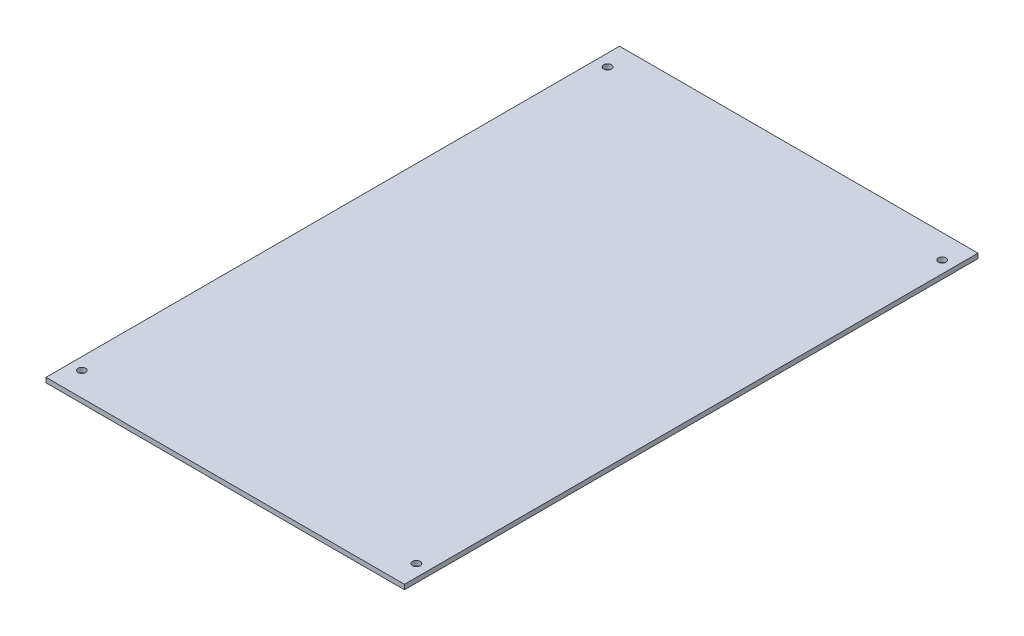
ISO-10303-21;
HEADER;
FILE_DESCRIPTION(('STEP AP214'),'2;1');
FILE_NAME('part.step','',(''),(''),'','','');
FILE_SCHEMA(('AUTOMOTIVE_DESIGN { 1 0 10303 214 1 1 1 1 }'));
ENDSEC;
DATA;
#1=APPLICATION_CONTEXT('core data for automotive mechanical design processes');
#2=APPLICATION_PROTOCOL_DEFINITION('international standard','automotive_design',2000,#1);
#3=PRODUCT_CONTEXT('',#1,'mechanical');
#4=PRODUCT('Part','Part','',(#3));
#5=PRODUCT_RELATED_PRODUCT_CATEGORY('part','',(#4));
#6=PRODUCT_DEFINITION_FORMATION('','',#4);
#7=PRODUCT_DEFINITION_CONTEXT('part definition',#1,'design');
#8=PRODUCT_DEFINITION('design','',#6,#7);
#9=PRODUCT_DEFINITION_SHAPE('','',#8);
#10=(LENGTH_UNIT() NAMED_UNIT(*) SI_UNIT(.MILLI.,.METRE.));
#11=(NAMED_UNIT(*) PLANE_ANGLE_UNIT() SI_UNIT($,.RADIAN.));
#12=(NAMED_UNIT(*) SI_UNIT($,.STERADIAN.) SOLID_ANGLE_UNIT());
#13=UNCERTAINTY_MEASURE_WITH_UNIT(LENGTH_MEASURE(1.E-05),#10,'distance_accuracy_value','');
#14=(GEOMETRIC_REPRESENTATION_CONTEXT(3) GLOBAL_UNCERTAINTY_ASSIGNED_CONTEXT((#13)) GLOBAL_UNIT_ASSIGNED_CONTEXT((#10,
#11,#12)) REPRESENTATION_CONTEXT('',''));
#15=CARTESIAN_POINT('',(0.,0.,0.));
#16=DIRECTION('',(0.,0.,1.));
#17=DIRECTION('',(1.,0.,0.));
#18=AXIS2_PLACEMENT_3D('',#15,#16,#17);
#19=CARTESIAN_POINT('',(0.,2.,0.));
#20=DIRECTION('',(1.,0.,0.));
#21=DIRECTION('',(0.,0.,-1.));
#22=AXIS2_PLACEMENT_3D('',#19,#20,#21);
#23=PLANE('',#22);
#24=DIRECTION('',(0.,0.,1.));
#25=VECTOR('',#24,1.);
#26=CARTESIAN_POINT('',(0.,0.,0.));
#27=LINE('',#26,#25);
#28=CARTESIAN_POINT('',(0.,0.,-240.));
#29=VERTEX_POINT('',#28);
#30=CARTESIAN_POINT('',(0.,0.,0.));
#31=VERTEX_POINT('',#30);
#32=EDGE_CURVE('E96',#29,#31,#27,.T.);
#33=ORIENTED_EDGE('',*,*,#32,.T.);
#34=DIRECTION('',(0.,-1.,0.));
#35=VECTOR('',#34,1.);
#36=CARTESIAN_POINT('',(0.,2.,0.));
#37=LINE('',#36,#35);
#38=CARTESIAN_POINT('',(0.,2.,0.));
#39=VERTEX_POINT('',#38);
#40=EDGE_CURVE('E11',#39,#31,#37,.T.);
#41=ORIENTED_EDGE('',*,*,#40,.F.);
#42=DIRECTION('',(0.,0.,1.));
#43=VECTOR('',#42,1.);
#44=CARTESIAN_POINT('',(0.,2.,0.));
#45=LINE('',#44,#43);
#46=CARTESIAN_POINT('',(0.,2.,-240.));
#47=VERTEX_POINT('',#46);
#48=EDGE_CURVE('E84',#47,#39,#45,.T.);
#49=ORIENTED_EDGE('',*,*,#48,.F.);
#50=DIRECTION('',(0.,-1.,0.));
#51=VECTOR('',#50,1.);
#52=CARTESIAN_POINT('',(0.,2.,-240.));
#53=LINE('',#52,#51);
#54=EDGE_CURVE('E92',#47,#29,#53,.T.);
#55=ORIENTED_EDGE('',*,*,#54,.T.);
#56=EDGE_LOOP('',(#33,#41,#49,#55));
#57=FACE_BOUND('',#56,.T.);
#58=ADVANCED_FACE('F33',(#57),#23,.F.);
#59=CARTESIAN_POINT('',(0.,2.,0.));
#60=DIRECTION('',(0.,0.,-1.));
#61=DIRECTION('',(-1.,0.,0.));
#62=AXIS2_PLACEMENT_3D('',#59,#60,#61);
#63=PLANE('',#62);
#64=DIRECTION('',(1.,0.,0.));
#65=VECTOR('',#64,1.);
#66=CARTESIAN_POINT('',(0.,0.,0.));
#67=LINE('',#66,#65);
#68=CARTESIAN_POINT('',(150.,0.,0.));
#69=VERTEX_POINT('',#68);
#70=EDGE_CURVE('E88',#31,#69,#67,.T.);
#71=ORIENTED_EDGE('',*,*,#70,.T.);
#72=DIRECTION('',(0.,-1.,0.));
#73=VECTOR('',#72,1.);
#74=CARTESIAN_POINT('',(150.,2.,0.));
#75=LINE('',#74,#73);
#76=CARTESIAN_POINT('',(150.,2.,0.));
#77=VERTEX_POINT('',#76);
#78=EDGE_CURVE('E41',#77,#69,#75,.T.);
#79=ORIENTED_EDGE('',*,*,#78,.F.);
#80=DIRECTION('',(1.,0.,0.));
#81=VECTOR('',#80,1.);
#82=CARTESIAN_POINT('',(0.,2.,0.));
#83=LINE('',#82,#81);
#84=EDGE_CURVE('E79',#39,#77,#83,.T.);
#85=ORIENTED_EDGE('',*,*,#84,.F.);
#86=ORIENTED_EDGE('',*,*,#40,.T.);
#87=EDGE_LOOP('',(#71,#79,#85,#86));
#88=FACE_BOUND('',#87,.T.);
#89=ADVANCED_FACE('F87',(#88),#63,.F.);
#90=CARTESIAN_POINT('',(150.,2.,0.));
#91=DIRECTION('',(-1.,0.,0.));
#92=DIRECTION('',(0.,0.,1.));
#93=AXIS2_PLACEMENT_3D('',#90,#91,#92);
#94=PLANE('',#93);
#95=DIRECTION('',(0.,0.,-1.));
#96=VECTOR('',#95,1.);
#97=CARTESIAN_POINT('',(150.,0.,0.));
#98=LINE('',#97,#96);
#99=CARTESIAN_POINT('',(150.,0.,-240.));
#100=VERTEX_POINT('',#99);
#101=EDGE_CURVE('E66',#69,#100,#98,.T.);
#102=ORIENTED_EDGE('',*,*,#101,.T.);
#103=DIRECTION('',(0.,-1.,0.));
#104=VECTOR('',#103,1.);
#105=CARTESIAN_POINT('',(150.,2.,-240.));
#106=LINE('',#105,#104);
#107=CARTESIAN_POINT('',(150.,2.,-240.));
#108=VERTEX_POINT('',#107);
#109=EDGE_CURVE('E89',#108,#100,#106,.T.);
#110=ORIENTED_EDGE('',*,*,#109,.F.);
#111=DIRECTION('',(0.,0.,-1.));
#112=VECTOR('',#111,1.);
#113=CARTESIAN_POINT('',(150.,2.,0.));
#114=LINE('',#113,#112);
#115=EDGE_CURVE('E82',#77,#108,#114,.T.);
#116=ORIENTED_EDGE('',*,*,#115,.F.);
#117=ORIENTED_EDGE('',*,*,#78,.T.);
#118=EDGE_LOOP('',(#102,#110,#116,#117));
#119=FACE_BOUND('',#118,.T.);
#120=ADVANCED_FACE('F90',(#119),#94,.F.);
#121=CARTESIAN_POINT('',(0.,2.,-240.));
#122=DIRECTION('',(0.,0.,1.));
#123=DIRECTION('',(1.,0.,0.));
#124=AXIS2_PLACEMENT_3D('',#121,#122,#123);
#125=PLANE('',#124);
#126=DIRECTION('',(-1.,0.,0.));
#127=VECTOR('',#126,1.);
#128=CARTESIAN_POINT('',(0.,0.,-240.));
#129=LINE('',#128,#127);
#130=EDGE_CURVE('E72',#100,#29,#129,.T.);
#131=ORIENTED_EDGE('',*,*,#130,.T.);
#132=ORIENTED_EDGE('',*,*,#54,.F.);
#133=DIRECTION('',(-1.,0.,0.));
#134=VECTOR('',#133,1.);
#135=CARTESIAN_POINT('',(0.,2.,-240.));
#136=LINE('',#135,#134);
#137=EDGE_CURVE('E49',#108,#47,#136,.T.);
#138=ORIENTED_EDGE('',*,*,#137,.F.);
#139=ORIENTED_EDGE('',*,*,#109,.T.);
#140=EDGE_LOOP('',(#131,#132,#138,#139));
#141=FACE_BOUND('',#140,.T.);
#142=ADVANCED_FACE('F104',(#141),#125,.F.);
#143=CARTESIAN_POINT('',(0.,2.,0.));
#144=DIRECTION('',(0.,-1.,0.));
#145=DIRECTION('',(0.,0.,-1.));
#146=AXIS2_PLACEMENT_3D('',#143,#144,#145);
#147=PLANE('',#146);
#148=CARTESIAN_POINT('',(5.,2.,-10.));
#149=DIRECTION('',(0.,1.,0.));
#150=DIRECTION('',(0.,0.,-1.));
#151=AXIS2_PLACEMENT_3D('',#148,#149,#150);
#152=CIRCLE('',#151,1.59999999999999);
#153=CARTESIAN_POINT('',(5.,2.,-11.6));
#154=VERTEX_POINT('',#153);
#155=EDGE_CURVE('E128',#154,#154,#152,.T.);
#156=ORIENTED_EDGE('',*,*,#155,.F.);
#157=EDGE_LOOP('',(#156));
#158=FACE_BOUND('',#157,.T.);
#159=CARTESIAN_POINT('',(145.,2.,-10.));
#160=DIRECTION('',(0.,1.,0.));
#161=DIRECTION('',(0.,0.,1.));
#162=AXIS2_PLACEMENT_3D('',#159,#160,#161);
#163=CIRCLE('',#162,1.59999999999999);
#164=CARTESIAN_POINT('',(145.,2.,-8.40000000000002));
#165=VERTEX_POINT('',#164);
#166=EDGE_CURVE('E122',#165,#165,#163,.T.);
#167=ORIENTED_EDGE('',*,*,#166,.F.);
#168=EDGE_LOOP('',(#167));
#169=FACE_BOUND('',#168,.T.);
#170=CARTESIAN_POINT('',(145.,2.,-230.));
#171=DIRECTION('',(0.,1.,0.));
#172=DIRECTION('',(0.,0.,-1.));
#173=AXIS2_PLACEMENT_3D('',#170,#171,#172);
#174=CIRCLE('',#173,1.59999999999999);
#175=CARTESIAN_POINT('',(145.,2.,-231.6));
#176=VERTEX_POINT('',#175);
#177=EDGE_CURVE('E116',#176,#176,#174,.T.);
#178=ORIENTED_EDGE('',*,*,#177,.F.);
#179=EDGE_LOOP('',(#178));
#180=FACE_BOUND('',#179,.T.);
#181=CARTESIAN_POINT('',(5.,2.,-230.));
#182=DIRECTION('',(0.,1.,0.));
#183=DIRECTION('',(0.,0.,1.));
#184=AXIS2_PLACEMENT_3D('',#181,#182,#183);
#185=CIRCLE('',#184,1.59999999999999);
#186=CARTESIAN_POINT('',(5.,2.,-228.4));
#187=VERTEX_POINT('',#186);
#188=EDGE_CURVE('E110',#187,#187,#185,.T.);
#189=ORIENTED_EDGE('',*,*,#188,.F.);
#190=EDGE_LOOP('',(#189));
#191=FACE_BOUND('',#190,.T.);
#192=ORIENTED_EDGE('',*,*,#48,.T.);
#193=ORIENTED_EDGE('',*,*,#84,.T.);
#194=ORIENTED_EDGE('',*,*,#115,.T.);
#195=ORIENTED_EDGE('',*,*,#137,.T.);
#196=EDGE_LOOP('',(#192,#193,#194,#195));
#197=FACE_BOUND('',#196,.T.);
#198=ADVANCED_FACE('F80',(#158,#169,#180,#191,#197),#147,.F.);
#199=CARTESIAN_POINT('',(0.,0.,0.));
#200=DIRECTION('',(0.,-1.,0.));
#201=DIRECTION('',(0.,0.,-1.));
#202=AXIS2_PLACEMENT_3D('',#199,#200,#201);
#203=PLANE('',#202);
#204=CARTESIAN_POINT('',(5.,0.,-10.));
#205=DIRECTION('',(0.,1.,0.));
#206=DIRECTION('',(0.,0.,-1.));
#207=AXIS2_PLACEMENT_3D('',#204,#205,#206);
#208=CIRCLE('',#207,1.59999999999999);
#209=CARTESIAN_POINT('',(5.,0.,-11.6));
#210=VERTEX_POINT('',#209);
#211=EDGE_CURVE('E125',#210,#210,#208,.T.);
#212=ORIENTED_EDGE('',*,*,#211,.T.);
#213=EDGE_LOOP('',(#212));
#214=FACE_BOUND('',#213,.T.);
#215=CARTESIAN_POINT('',(145.,0.,-10.));
#216=DIRECTION('',(0.,1.,0.));
#217=DIRECTION('',(0.,0.,1.));
#218=AXIS2_PLACEMENT_3D('',#215,#216,#217);
#219=CIRCLE('',#218,1.59999999999999);
#220=CARTESIAN_POINT('',(145.,0.,-8.40000000000002));
#221=VERTEX_POINT('',#220);
#222=EDGE_CURVE('E119',#221,#221,#219,.T.);
#223=ORIENTED_EDGE('',*,*,#222,.T.);
#224=EDGE_LOOP('',(#223));
#225=FACE_BOUND('',#224,.T.);
#226=CARTESIAN_POINT('',(145.,0.,-230.));
#227=DIRECTION('',(0.,1.,0.));
#228=DIRECTION('',(0.,0.,-1.));
#229=AXIS2_PLACEMENT_3D('',#226,#227,#228);
#230=CIRCLE('',#229,1.59999999999999);
#231=CARTESIAN_POINT('',(145.,0.,-231.6));
#232=VERTEX_POINT('',#231);
#233=EDGE_CURVE('E113',#232,#232,#230,.T.);
#234=ORIENTED_EDGE('',*,*,#233,.T.);
#235=EDGE_LOOP('',(#234));
#236=FACE_BOUND('',#235,.T.);
#237=CARTESIAN_POINT('',(5.,0.,-230.));
#238=DIRECTION('',(0.,1.,0.));
#239=DIRECTION('',(0.,0.,1.));
#240=AXIS2_PLACEMENT_3D('',#237,#238,#239);
#241=CIRCLE('',#240,1.59999999999999);
#242=CARTESIAN_POINT('',(5.,0.,-228.4));
#243=VERTEX_POINT('',#242);
#244=EDGE_CURVE('E99',#243,#243,#241,.T.);
#245=ORIENTED_EDGE('',*,*,#244,.T.);
#246=EDGE_LOOP('',(#245));
#247=FACE_BOUND('',#246,.T.);
#248=ORIENTED_EDGE('',*,*,#32,.F.);
#249=ORIENTED_EDGE('',*,*,#130,.F.);
#250=ORIENTED_EDGE('',*,*,#101,.F.);
#251=ORIENTED_EDGE('',*,*,#70,.F.);
#252=EDGE_LOOP('',(#248,#249,#250,#251));
#253=FACE_BOUND('',#252,.T.);
#254=ADVANCED_FACE('F107',(#214,#225,#236,#247,#253),#203,.T.);
#255=CARTESIAN_POINT('',(5.,0.,-230.));
#256=DIRECTION('',(0.,1.,0.));
#257=DIRECTION('',(0.,0.,1.));
#258=AXIS2_PLACEMENT_3D('',#255,#256,#257);
#259=CYLINDRICAL_SURFACE('',#258,1.59999999999999);
#260=ORIENTED_EDGE('',*,*,#244,.F.);
#261=EDGE_LOOP('',(#260));
#262=FACE_BOUND('',#261,.T.);
#263=ORIENTED_EDGE('',*,*,#188,.T.);
#264=EDGE_LOOP('',(#263));
#265=FACE_BOUND('',#264,.T.);
#266=ADVANCED_FACE('F152',(#262,#265),#259,.F.);
#267=CARTESIAN_POINT('',(145.,0.,-230.));
#268=DIRECTION('',(0.,1.,0.));
#269=DIRECTION('',(0.,0.,1.));
#270=AXIS2_PLACEMENT_3D('',#267,#268,#269);
#271=CYLINDRICAL_SURFACE('',#270,1.59999999999999);
#272=ORIENTED_EDGE('',*,*,#233,.F.);
#273=EDGE_LOOP('',(#272));
#274=FACE_BOUND('',#273,.T.);
#275=ORIENTED_EDGE('',*,*,#177,.T.);
#276=EDGE_LOOP('',(#275));
#277=FACE_BOUND('',#276,.T.);
#278=ADVANCED_FACE('F154',(#274,#277),#271,.F.);
#279=CARTESIAN_POINT('',(145.,0.,-10.));
#280=DIRECTION('',(0.,1.,0.));
#281=DIRECTION('',(0.,0.,1.));
#282=AXIS2_PLACEMENT_3D('',#279,#280,#281);
#283=CYLINDRICAL_SURFACE('',#282,1.59999999999999);
#284=ORIENTED_EDGE('',*,*,#222,.F.);
#285=EDGE_LOOP('',(#284));
#286=FACE_BOUND('',#285,.T.);
#287=ORIENTED_EDGE('',*,*,#166,.T.);
#288=EDGE_LOOP('',(#287));
#289=FACE_BOUND('',#288,.T.);
#290=ADVANCED_FACE('F139',(#286,#289),#283,.F.);
#291=CARTESIAN_POINT('',(5.,0.,-10.));
#292=DIRECTION('',(0.,1.,0.));
#293=DIRECTION('',(0.,0.,1.));
#294=AXIS2_PLACEMENT_3D('',#291,#292,#293);
#295=CYLINDRICAL_SURFACE('',#294,1.59999999999999);
#296=ORIENTED_EDGE('',*,*,#211,.F.);
#297=EDGE_LOOP('',(#296));
#298=FACE_BOUND('',#297,.T.);
#299=ORIENTED_EDGE('',*,*,#155,.T.);
#300=EDGE_LOOP('',(#299));
#301=FACE_BOUND('',#300,.T.);
#302=ADVANCED_FACE('F136',(#298,#301),#295,.F.);
#303=CLOSED_SHELL('',(#58,#89,#120,#142,#198,#254,#266,#278,#290,#302));
#304=MANIFOLD_SOLID_BREP('B2',#303);
#305=ADVANCED_BREP_SHAPE_REPRESENTATION('',(#18,#304),#14);
#306=SHAPE_DEFINITION_REPRESENTATION(#9,#305);
ENDSEC;
END-ISO-10303-21;
